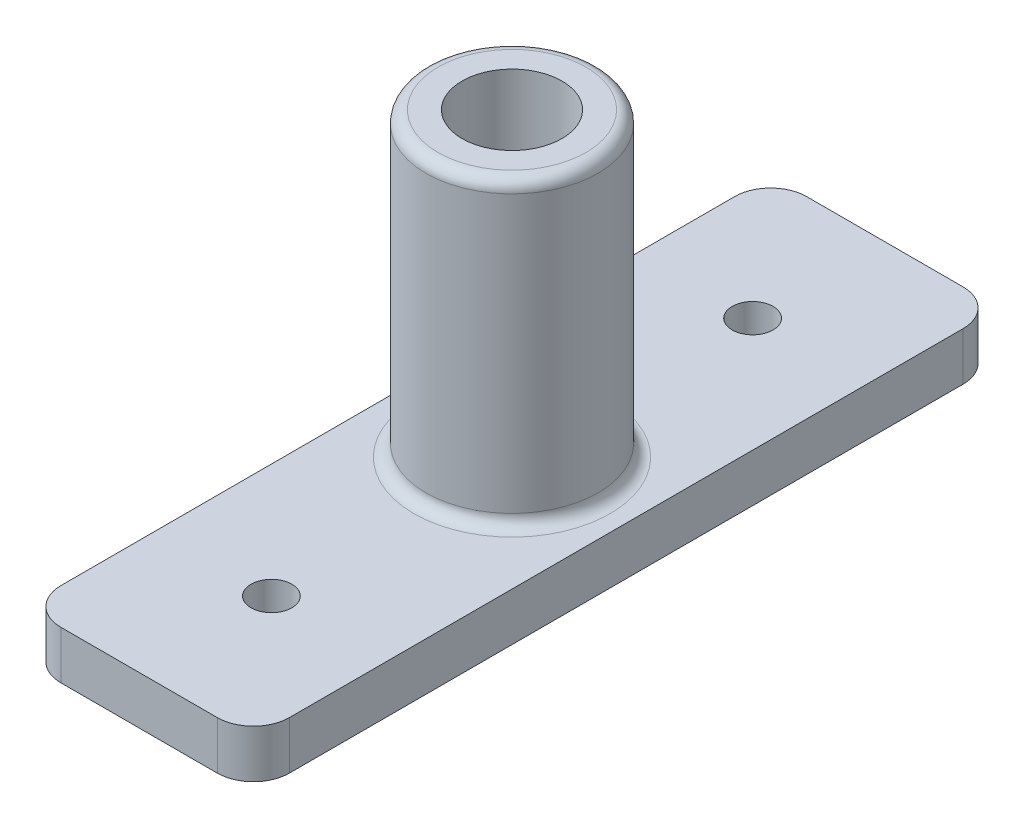
ISO-10303-21;
HEADER;
FILE_DESCRIPTION(('STEP AP214'),'2;1');
FILE_NAME('part.step','',(''),(''),'','','');
FILE_SCHEMA(('AUTOMOTIVE_DESIGN { 1 0 10303 214 1 1 1 1 }'));
ENDSEC;
DATA;
#1=APPLICATION_CONTEXT('core data for automotive mechanical design processes');
#2=APPLICATION_PROTOCOL_DEFINITION('international standard','automotive_design',2000,#1);
#3=PRODUCT_CONTEXT('',#1,'mechanical');
#4=PRODUCT('Part','Part','',(#3));
#5=PRODUCT_RELATED_PRODUCT_CATEGORY('part','',(#4));
#6=PRODUCT_DEFINITION_FORMATION('','',#4);
#7=PRODUCT_DEFINITION_CONTEXT('part definition',#1,'design');
#8=PRODUCT_DEFINITION('design','',#6,#7);
#9=PRODUCT_DEFINITION_SHAPE('','',#8);
#10=(LENGTH_UNIT() NAMED_UNIT(*) SI_UNIT(.MILLI.,.METRE.));
#11=(NAMED_UNIT(*) PLANE_ANGLE_UNIT() SI_UNIT($,.RADIAN.));
#12=(NAMED_UNIT(*) SI_UNIT($,.STERADIAN.) SOLID_ANGLE_UNIT());
#13=UNCERTAINTY_MEASURE_WITH_UNIT(LENGTH_MEASURE(1.E-05),#10,'distance_accuracy_value','');
#14=(GEOMETRIC_REPRESENTATION_CONTEXT(3) GLOBAL_UNCERTAINTY_ASSIGNED_CONTEXT((#13)) GLOBAL_UNIT_ASSIGNED_CONTEXT((#10,
#11,#12)) REPRESENTATION_CONTEXT('',''));
#15=CARTESIAN_POINT('',(0.,0.,0.));
#16=DIRECTION('',(0.,0.,1.));
#17=DIRECTION('',(1.,0.,0.));
#18=AXIS2_PLACEMENT_3D('',#15,#16,#17);
#19=CARTESIAN_POINT('',(0.,4.,0.));
#20=DIRECTION('',(0.,1.,0.));
#21=DIRECTION('',(0.,0.,1.));
#22=AXIS2_PLACEMENT_3D('',#19,#20,#21);
#23=PLANE('',#22);
#24=CARTESIAN_POINT('',(0.,4.,0.));
#25=DIRECTION('',(0.,1.,0.));
#26=DIRECTION('',(0.,0.,1.));
#27=AXIS2_PLACEMENT_3D('',#24,#25,#26);
#28=CIRCLE('',#27,8.15);
#29=CARTESIAN_POINT('',(0.,4.,8.15));
#30=VERTEX_POINT('',#29);
#31=EDGE_CURVE('E11',#30,#30,#28,.F.);
#32=ORIENTED_EDGE('',*,*,#31,.T.);
#33=EDGE_LOOP('',(#32));
#34=FACE_BOUND('',#33,.T.);
#35=CARTESIAN_POINT('',(0.,4.,-20.));
#36=DIRECTION('',(0.,1.,0.));
#37=DIRECTION('',(0.,0.,1.));
#38=AXIS2_PLACEMENT_3D('',#35,#36,#37);
#39=CIRCLE('',#38,1.7);
#40=CARTESIAN_POINT('',(0.,4.,-18.3));
#41=VERTEX_POINT('',#40);
#42=EDGE_CURVE('E130',#41,#41,#39,.T.);
#43=ORIENTED_EDGE('',*,*,#42,.F.);
#44=EDGE_LOOP('',(#43));
#45=FACE_BOUND('',#44,.T.);
#46=DIRECTION('',(-1.,0.,0.));
#47=VECTOR('',#46,1.);
#48=CARTESIAN_POINT('',(9.5,4.,-31.));
#49=LINE('',#48,#47);
#50=CARTESIAN_POINT('',(6.5,4.,-31.));
#51=VERTEX_POINT('',#50);
#52=CARTESIAN_POINT('',(-6.5,4.,-31.));
#53=VERTEX_POINT('',#52);
#54=EDGE_CURVE('E139',#51,#53,#49,.T.);
#55=ORIENTED_EDGE('',*,*,#54,.T.);
#56=CARTESIAN_POINT('',(-6.5,4.,-28.));
#57=DIRECTION('',(0.,1.,0.));
#58=DIRECTION('',(0.,0.,1.));
#59=AXIS2_PLACEMENT_3D('',#56,#57,#58);
#60=CIRCLE('',#59,3.);
#61=CARTESIAN_POINT('',(-9.5,4.,-28.));
#62=VERTEX_POINT('',#61);
#63=EDGE_CURVE('E161',#53,#62,#60,.T.);
#64=ORIENTED_EDGE('',*,*,#63,.T.);
#65=DIRECTION('',(0.,0.,1.));
#66=VECTOR('',#65,1.);
#67=CARTESIAN_POINT('',(-9.5,4.,31.));
#68=LINE('',#67,#66);
#69=CARTESIAN_POINT('',(-9.5,4.,28.));
#70=VERTEX_POINT('',#69);
#71=EDGE_CURVE('E122',#62,#70,#68,.T.);
#72=ORIENTED_EDGE('',*,*,#71,.T.);
#73=CARTESIAN_POINT('',(-6.5,4.,28.));
#74=DIRECTION('',(0.,1.,0.));
#75=DIRECTION('',(0.,0.,1.));
#76=AXIS2_PLACEMENT_3D('',#73,#74,#75);
#77=CIRCLE('',#76,3.);
#78=CARTESIAN_POINT('',(-6.5,4.,31.));
#79=VERTEX_POINT('',#78);
#80=EDGE_CURVE('E159',#70,#79,#77,.T.);
#81=ORIENTED_EDGE('',*,*,#80,.T.);
#82=DIRECTION('',(1.,0.,0.));
#83=VECTOR('',#82,1.);
#84=CARTESIAN_POINT('',(9.5,4.,31.));
#85=LINE('',#84,#83);
#86=CARTESIAN_POINT('',(6.5,4.,31.));
#87=VERTEX_POINT('',#86);
#88=EDGE_CURVE('E209',#79,#87,#85,.T.);
#89=ORIENTED_EDGE('',*,*,#88,.T.);
#90=CARTESIAN_POINT('',(6.5,4.,28.));
#91=DIRECTION('',(0.,1.,0.));
#92=DIRECTION('',(0.,0.,1.));
#93=AXIS2_PLACEMENT_3D('',#90,#91,#92);
#94=CIRCLE('',#93,3.);
#95=CARTESIAN_POINT('',(9.5,4.,28.));
#96=VERTEX_POINT('',#95);
#97=EDGE_CURVE('E57',#87,#96,#94,.T.);
#98=ORIENTED_EDGE('',*,*,#97,.T.);
#99=DIRECTION('',(0.,0.,-1.));
#100=VECTOR('',#99,1.);
#101=CARTESIAN_POINT('',(9.5,4.,31.));
#102=LINE('',#101,#100);
#103=CARTESIAN_POINT('',(9.5,4.,-28.));
#104=VERTEX_POINT('',#103);
#105=EDGE_CURVE('E210',#96,#104,#102,.T.);
#106=ORIENTED_EDGE('',*,*,#105,.T.);
#107=CARTESIAN_POINT('',(6.5,4.,-28.));
#108=DIRECTION('',(0.,1.,0.));
#109=DIRECTION('',(0.,0.,1.));
#110=AXIS2_PLACEMENT_3D('',#107,#108,#109);
#111=CIRCLE('',#110,3.);
#112=EDGE_CURVE('E157',#104,#51,#111,.T.);
#113=ORIENTED_EDGE('',*,*,#112,.T.);
#114=EDGE_LOOP('',(#55,#64,#72,#81,#89,#98,#106,#113));
#115=FACE_BOUND('',#114,.T.);
#116=CARTESIAN_POINT('',(0.,4.,20.));
#117=DIRECTION('',(0.,1.,0.));
#118=DIRECTION('',(0.,0.,1.));
#119=AXIS2_PLACEMENT_3D('',#116,#117,#118);
#120=CIRCLE('',#119,1.7);
#121=CARTESIAN_POINT('',(0.,4.,21.7));
#122=VERTEX_POINT('',#121);
#123=EDGE_CURVE('E201',#122,#122,#120,.T.);
#124=ORIENTED_EDGE('',*,*,#123,.F.);
#125=EDGE_LOOP('',(#124));
#126=FACE_BOUND('',#125,.T.);
#127=ADVANCED_FACE('F35',(#34,#45,#115,#126),#23,.T.);
#128=CARTESIAN_POINT('',(0.,0.,0.));
#129=DIRECTION('',(0.,1.,0.));
#130=DIRECTION('',(0.,0.,1.));
#131=AXIS2_PLACEMENT_3D('',#128,#129,#130);
#132=PLANE('',#131);
#133=DIRECTION('',(0.,0.,1.));
#134=VECTOR('',#133,1.);
#135=CARTESIAN_POINT('',(-9.5,0.,31.));
#136=LINE('',#135,#134);
#137=CARTESIAN_POINT('',(-9.5,0.,-28.));
#138=VERTEX_POINT('',#137);
#139=CARTESIAN_POINT('',(-9.5,0.,28.));
#140=VERTEX_POINT('',#139);
#141=EDGE_CURVE('E119',#138,#140,#136,.T.);
#142=ORIENTED_EDGE('',*,*,#141,.F.);
#143=CARTESIAN_POINT('',(-6.5,0.,-28.));
#144=DIRECTION('',(0.,1.,0.));
#145=DIRECTION('',(0.,0.,1.));
#146=AXIS2_PLACEMENT_3D('',#143,#144,#145);
#147=CIRCLE('',#146,3.);
#148=CARTESIAN_POINT('',(-6.5,0.,-31.));
#149=VERTEX_POINT('',#148);
#150=EDGE_CURVE('E102',#138,#149,#147,.F.);
#151=ORIENTED_EDGE('',*,*,#150,.T.);
#152=DIRECTION('',(-1.,0.,0.));
#153=VECTOR('',#152,1.);
#154=CARTESIAN_POINT('',(9.5,0.,-31.));
#155=LINE('',#154,#153);
#156=CARTESIAN_POINT('',(6.5,0.,-31.));
#157=VERTEX_POINT('',#156);
#158=EDGE_CURVE('E143',#157,#149,#155,.T.);
#159=ORIENTED_EDGE('',*,*,#158,.F.);
#160=CARTESIAN_POINT('',(6.5,0.,-28.));
#161=DIRECTION('',(0.,1.,0.));
#162=DIRECTION('',(0.,0.,1.));
#163=AXIS2_PLACEMENT_3D('',#160,#161,#162);
#164=CIRCLE('',#163,3.);
#165=CARTESIAN_POINT('',(9.5,0.,-28.));
#166=VERTEX_POINT('',#165);
#167=EDGE_CURVE('E150',#157,#166,#164,.F.);
#168=ORIENTED_EDGE('',*,*,#167,.T.);
#169=DIRECTION('',(0.,0.,-1.));
#170=VECTOR('',#169,1.);
#171=CARTESIAN_POINT('',(9.5,0.,31.));
#172=LINE('',#171,#170);
#173=CARTESIAN_POINT('',(9.5,0.,28.));
#174=VERTEX_POINT('',#173);
#175=EDGE_CURVE('E133',#174,#166,#172,.T.);
#176=ORIENTED_EDGE('',*,*,#175,.F.);
#177=CARTESIAN_POINT('',(6.5,0.,28.));
#178=DIRECTION('',(0.,1.,0.));
#179=DIRECTION('',(0.,0.,1.));
#180=AXIS2_PLACEMENT_3D('',#177,#178,#179);
#181=CIRCLE('',#180,3.);
#182=CARTESIAN_POINT('',(6.5,0.,31.));
#183=VERTEX_POINT('',#182);
#184=EDGE_CURVE('E123',#174,#183,#181,.F.);
#185=ORIENTED_EDGE('',*,*,#184,.T.);
#186=DIRECTION('',(1.,0.,0.));
#187=VECTOR('',#186,1.);
#188=CARTESIAN_POINT('',(9.5,0.,31.));
#189=LINE('',#188,#187);
#190=CARTESIAN_POINT('',(-6.5,0.,31.));
#191=VERTEX_POINT('',#190);
#192=EDGE_CURVE('E129',#191,#183,#189,.T.);
#193=ORIENTED_EDGE('',*,*,#192,.F.);
#194=CARTESIAN_POINT('',(-6.5,0.,28.));
#195=DIRECTION('',(0.,1.,0.));
#196=DIRECTION('',(0.,0.,1.));
#197=AXIS2_PLACEMENT_3D('',#194,#195,#196);
#198=CIRCLE('',#197,3.);
#199=EDGE_CURVE('E113',#191,#140,#198,.F.);
#200=ORIENTED_EDGE('',*,*,#199,.T.);
#201=EDGE_LOOP('',(#142,#151,#159,#168,#176,#185,#193,#200));
#202=FACE_BOUND('',#201,.T.);
#203=CARTESIAN_POINT('',(0.,0.,-20.));
#204=DIRECTION('',(0.,1.,0.));
#205=DIRECTION('',(0.,0.,1.));
#206=AXIS2_PLACEMENT_3D('',#203,#204,#205);
#207=CIRCLE('',#206,1.7);
#208=CARTESIAN_POINT('',(0.,0.,-18.3));
#209=VERTEX_POINT('',#208);
#210=EDGE_CURVE('E136',#209,#209,#207,.T.);
#211=ORIENTED_EDGE('',*,*,#210,.T.);
#212=EDGE_LOOP('',(#211));
#213=FACE_BOUND('',#212,.T.);
#214=CARTESIAN_POINT('',(0.,0.,20.));
#215=DIRECTION('',(0.,1.,0.));
#216=DIRECTION('',(0.,0.,1.));
#217=AXIS2_PLACEMENT_3D('',#214,#215,#216);
#218=CIRCLE('',#217,1.7);
#219=CARTESIAN_POINT('',(0.,0.,21.7));
#220=VERTEX_POINT('',#219);
#221=EDGE_CURVE('E198',#220,#220,#218,.T.);
#222=ORIENTED_EDGE('',*,*,#221,.T.);
#223=EDGE_LOOP('',(#222));
#224=FACE_BOUND('',#223,.T.);
#225=ADVANCED_FACE('F126',(#202,#213,#224),#132,.F.);
#226=CARTESIAN_POINT('',(-9.5,4.,31.));
#227=DIRECTION('',(1.,0.,0.));
#228=DIRECTION('',(0.,0.,-1.));
#229=AXIS2_PLACEMENT_3D('',#226,#227,#228);
#230=PLANE('',#229);
#231=ORIENTED_EDGE('',*,*,#71,.F.);
#232=DIRECTION('',(0.,-1.,0.));
#233=VECTOR('',#232,1.);
#234=CARTESIAN_POINT('',(-9.5,4.,-28.));
#235=LINE('',#234,#233);
#236=EDGE_CURVE('E106',#62,#138,#235,.T.);
#237=ORIENTED_EDGE('',*,*,#236,.T.);
#238=ORIENTED_EDGE('',*,*,#141,.T.);
#239=DIRECTION('',(0.,-1.,0.));
#240=VECTOR('',#239,1.);
#241=CARTESIAN_POINT('',(-9.5,4.,28.));
#242=LINE('',#241,#240);
#243=EDGE_CURVE('E124',#140,#70,#242,.F.);
#244=ORIENTED_EDGE('',*,*,#243,.T.);
#245=EDGE_LOOP('',(#231,#237,#238,#244));
#246=FACE_BOUND('',#245,.T.);
#247=ADVANCED_FACE('F118',(#246),#230,.F.);
#248=CARTESIAN_POINT('',(9.5,4.,31.));
#249=DIRECTION('',(0.,0.,-1.));
#250=DIRECTION('',(-1.,0.,0.));
#251=AXIS2_PLACEMENT_3D('',#248,#249,#250);
#252=PLANE('',#251);
#253=ORIENTED_EDGE('',*,*,#88,.F.);
#254=DIRECTION('',(0.,-1.,0.));
#255=VECTOR('',#254,1.);
#256=CARTESIAN_POINT('',(-6.5,4.,31.));
#257=LINE('',#256,#255);
#258=EDGE_CURVE('E165',#79,#191,#257,.T.);
#259=ORIENTED_EDGE('',*,*,#258,.T.);
#260=ORIENTED_EDGE('',*,*,#192,.T.);
#261=DIRECTION('',(0.,-1.,0.));
#262=VECTOR('',#261,1.);
#263=CARTESIAN_POINT('',(6.5,4.,31.));
#264=LINE('',#263,#262);
#265=EDGE_CURVE('E163',#183,#87,#264,.F.);
#266=ORIENTED_EDGE('',*,*,#265,.T.);
#267=EDGE_LOOP('',(#253,#259,#260,#266));
#268=FACE_BOUND('',#267,.T.);
#269=ADVANCED_FACE('F227',(#268),#252,.F.);
#270=CARTESIAN_POINT('',(9.5,4.,31.));
#271=DIRECTION('',(-1.,0.,0.));
#272=DIRECTION('',(0.,0.,1.));
#273=AXIS2_PLACEMENT_3D('',#270,#271,#272);
#274=PLANE('',#273);
#275=ORIENTED_EDGE('',*,*,#175,.T.);
#276=DIRECTION('',(0.,-1.,0.));
#277=VECTOR('',#276,1.);
#278=CARTESIAN_POINT('',(9.5,4.,-28.));
#279=LINE('',#278,#277);
#280=EDGE_CURVE('E50',#166,#104,#279,.F.);
#281=ORIENTED_EDGE('',*,*,#280,.T.);
#282=ORIENTED_EDGE('',*,*,#105,.F.);
#283=DIRECTION('',(0.,-1.,0.));
#284=VECTOR('',#283,1.);
#285=CARTESIAN_POINT('',(9.5,4.,28.));
#286=LINE('',#285,#284);
#287=EDGE_CURVE('E168',#96,#174,#286,.T.);
#288=ORIENTED_EDGE('',*,*,#287,.T.);
#289=EDGE_LOOP('',(#275,#281,#282,#288));
#290=FACE_BOUND('',#289,.T.);
#291=ADVANCED_FACE('F221',(#290),#274,.F.);
#292=CARTESIAN_POINT('',(9.5,4.,-31.));
#293=DIRECTION('',(0.,0.,1.));
#294=DIRECTION('',(1.,0.,0.));
#295=AXIS2_PLACEMENT_3D('',#292,#293,#294);
#296=PLANE('',#295);
#297=ORIENTED_EDGE('',*,*,#158,.T.);
#298=DIRECTION('',(0.,-1.,0.));
#299=VECTOR('',#298,1.);
#300=CARTESIAN_POINT('',(-6.5,4.,-31.));
#301=LINE('',#300,#299);
#302=EDGE_CURVE('E107',#149,#53,#301,.F.);
#303=ORIENTED_EDGE('',*,*,#302,.T.);
#304=ORIENTED_EDGE('',*,*,#54,.F.);
#305=DIRECTION('',(0.,-1.,0.));
#306=VECTOR('',#305,1.);
#307=CARTESIAN_POINT('',(6.5,4.,-31.));
#308=LINE('',#307,#306);
#309=EDGE_CURVE('E112',#51,#157,#308,.T.);
#310=ORIENTED_EDGE('',*,*,#309,.T.);
#311=EDGE_LOOP('',(#297,#303,#304,#310));
#312=FACE_BOUND('',#311,.T.);
#313=ADVANCED_FACE('F217',(#312),#296,.F.);
#314=CARTESIAN_POINT('',(0.,4.,-20.));
#315=DIRECTION('',(0.,-1.,0.));
#316=DIRECTION('',(0.,0.,-1.));
#317=AXIS2_PLACEMENT_3D('',#314,#315,#316);
#318=CYLINDRICAL_SURFACE('',#317,1.7);
#319=ORIENTED_EDGE('',*,*,#42,.T.);
#320=EDGE_LOOP('',(#319));
#321=FACE_BOUND('',#320,.T.);
#322=ORIENTED_EDGE('',*,*,#210,.F.);
#323=EDGE_LOOP('',(#322));
#324=FACE_BOUND('',#323,.T.);
#325=ADVANCED_FACE('F265',(#321,#324),#318,.F.);
#326=CARTESIAN_POINT('',(0.,4.,20.));
#327=DIRECTION('',(0.,-1.,0.));
#328=DIRECTION('',(0.,0.,-1.));
#329=AXIS2_PLACEMENT_3D('',#326,#327,#328);
#330=CYLINDRICAL_SURFACE('',#329,1.7);
#331=ORIENTED_EDGE('',*,*,#123,.T.);
#332=EDGE_LOOP('',(#331));
#333=FACE_BOUND('',#332,.T.);
#334=ORIENTED_EDGE('',*,*,#221,.F.);
#335=EDGE_LOOP('',(#334));
#336=FACE_BOUND('',#335,.T.);
#337=ADVANCED_FACE('F192',(#333,#336),#330,.F.);
#338=CARTESIAN_POINT('',(0.,29.,0.));
#339=DIRECTION('',(0.,1.,0.));
#340=DIRECTION('',(0.,0.,1.));
#341=AXIS2_PLACEMENT_3D('',#338,#339,#340);
#342=PLANE('',#341);
#343=CARTESIAN_POINT('',(0.,29.,0.));
#344=DIRECTION('',(0.,1.,0.));
#345=DIRECTION('',(0.,0.,1.));
#346=AXIS2_PLACEMENT_3D('',#343,#344,#345);
#347=CIRCLE('',#346,6.15);
#348=CARTESIAN_POINT('',(0.,29.,6.15));
#349=VERTEX_POINT('',#348);
#350=EDGE_CURVE('E172',#349,#349,#347,.T.);
#351=ORIENTED_EDGE('',*,*,#350,.T.);
#352=EDGE_LOOP('',(#351));
#353=FACE_BOUND('',#352,.T.);
#354=CARTESIAN_POINT('',(0.,29.,0.));
#355=DIRECTION('',(0.,1.,0.));
#356=DIRECTION('',(0.,0.,1.));
#357=AXIS2_PLACEMENT_3D('',#354,#355,#356);
#358=CIRCLE('',#357,4.15);
#359=CARTESIAN_POINT('',(0.,29.,4.15));
#360=VERTEX_POINT('',#359);
#361=EDGE_CURVE('E196',#360,#360,#358,.T.);
#362=ORIENTED_EDGE('',*,*,#361,.F.);
#363=EDGE_LOOP('',(#362));
#364=FACE_BOUND('',#363,.T.);
#365=ADVANCED_FACE('F189',(#353,#364),#342,.T.);
#366=CARTESIAN_POINT('',(0.,29.,0.));
#367=DIRECTION('',(0.,-1.,0.));
#368=DIRECTION('',(0.,0.,-1.));
#369=AXIS2_PLACEMENT_3D('',#366,#367,#368);
#370=CYLINDRICAL_SURFACE('',#369,7.15);
#371=CARTESIAN_POINT('',(0.,28.,0.));
#372=DIRECTION('',(0.,1.,0.));
#373=DIRECTION('',(0.,0.,1.));
#374=AXIS2_PLACEMENT_3D('',#371,#372,#373);
#375=CIRCLE('',#374,7.15);
#376=CARTESIAN_POINT('',(0.,28.,7.15));
#377=VERTEX_POINT('',#376);
#378=EDGE_CURVE('E43',#377,#377,#375,.F.);
#379=ORIENTED_EDGE('',*,*,#378,.T.);
#380=EDGE_LOOP('',(#379));
#381=FACE_BOUND('',#380,.T.);
#382=CARTESIAN_POINT('',(0.,5.,0.));
#383=DIRECTION('',(0.,1.,0.));
#384=DIRECTION('',(0.,0.,1.));
#385=AXIS2_PLACEMENT_3D('',#382,#383,#384);
#386=CIRCLE('',#385,7.15);
#387=CARTESIAN_POINT('',(0.,5.,7.15));
#388=VERTEX_POINT('',#387);
#389=EDGE_CURVE('E175',#388,#388,#386,.T.);
#390=ORIENTED_EDGE('',*,*,#389,.T.);
#391=EDGE_LOOP('',(#390));
#392=FACE_BOUND('',#391,.T.);
#393=ADVANCED_FACE('F180',(#381,#392),#370,.T.);
#394=CARTESIAN_POINT('',(0.,29.,0.));
#395=DIRECTION('',(0.,-1.,0.));
#396=DIRECTION('',(0.,0.,-1.));
#397=AXIS2_PLACEMENT_3D('',#394,#395,#396);
#398=CYLINDRICAL_SURFACE('',#397,4.15);
#399=ORIENTED_EDGE('',*,*,#361,.T.);
#400=EDGE_LOOP('',(#399));
#401=FACE_BOUND('',#400,.T.);
#402=CARTESIAN_POINT('',(0.,4.,0.));
#403=DIRECTION('',(0.,1.,0.));
#404=DIRECTION('',(0.,0.,1.));
#405=AXIS2_PLACEMENT_3D('',#402,#403,#404);
#406=CIRCLE('',#405,4.15);
#407=CARTESIAN_POINT('',(0.,4.,4.15));
#408=VERTEX_POINT('',#407);
#409=EDGE_CURVE('E145',#408,#408,#406,.F.);
#410=ORIENTED_EDGE('',*,*,#409,.T.);
#411=EDGE_LOOP('',(#410));
#412=FACE_BOUND('',#411,.T.);
#413=ADVANCED_FACE('F251',(#401,#412),#398,.F.);
#414=ORIENTED_EDGE('',*,*,#409,.F.);
#415=EDGE_LOOP('',(#414));
#416=FACE_BOUND('',#415,.T.);
#417=ADVANCED_FACE('F239',(#416),#23,.T.);
#418=CARTESIAN_POINT('',(-6.5,4.,-28.));
#419=DIRECTION('',(0.,-1.,0.));
#420=DIRECTION('',(0.,0.,-1.));
#421=AXIS2_PLACEMENT_3D('',#418,#419,#420);
#422=CYLINDRICAL_SURFACE('',#421,3.);
#423=ORIENTED_EDGE('',*,*,#63,.F.);
#424=ORIENTED_EDGE('',*,*,#302,.F.);
#425=ORIENTED_EDGE('',*,*,#150,.F.);
#426=ORIENTED_EDGE('',*,*,#236,.F.);
#427=EDGE_LOOP('',(#423,#424,#425,#426));
#428=FACE_BOUND('',#427,.T.);
#429=ADVANCED_FACE('F105',(#428),#422,.T.);
#430=CARTESIAN_POINT('',(-6.5,4.,28.));
#431=DIRECTION('',(0.,-1.,0.));
#432=DIRECTION('',(0.,0.,-1.));
#433=AXIS2_PLACEMENT_3D('',#430,#431,#432);
#434=CYLINDRICAL_SURFACE('',#433,3.);
#435=ORIENTED_EDGE('',*,*,#80,.F.);
#436=ORIENTED_EDGE('',*,*,#243,.F.);
#437=ORIENTED_EDGE('',*,*,#199,.F.);
#438=ORIENTED_EDGE('',*,*,#258,.F.);
#439=EDGE_LOOP('',(#435,#436,#437,#438));
#440=FACE_BOUND('',#439,.T.);
#441=ADVANCED_FACE('F231',(#440),#434,.T.);
#442=CARTESIAN_POINT('',(6.5,4.,-28.));
#443=DIRECTION('',(0.,-1.,0.));
#444=DIRECTION('',(0.,0.,-1.));
#445=AXIS2_PLACEMENT_3D('',#442,#443,#444);
#446=CYLINDRICAL_SURFACE('',#445,3.);
#447=ORIENTED_EDGE('',*,*,#112,.F.);
#448=ORIENTED_EDGE('',*,*,#280,.F.);
#449=ORIENTED_EDGE('',*,*,#167,.F.);
#450=ORIENTED_EDGE('',*,*,#309,.F.);
#451=EDGE_LOOP('',(#447,#448,#449,#450));
#452=FACE_BOUND('',#451,.T.);
#453=ADVANCED_FACE('F219',(#452),#446,.T.);
#454=CARTESIAN_POINT('',(6.5,4.,28.));
#455=DIRECTION('',(0.,-1.,0.));
#456=DIRECTION('',(0.,0.,-1.));
#457=AXIS2_PLACEMENT_3D('',#454,#455,#456);
#458=CYLINDRICAL_SURFACE('',#457,3.);
#459=ORIENTED_EDGE('',*,*,#97,.F.);
#460=ORIENTED_EDGE('',*,*,#265,.F.);
#461=ORIENTED_EDGE('',*,*,#184,.F.);
#462=ORIENTED_EDGE('',*,*,#287,.F.);
#463=EDGE_LOOP('',(#459,#460,#461,#462));
#464=FACE_BOUND('',#463,.T.);
#465=ADVANCED_FACE('F186',(#464),#458,.T.);
#466=CARTESIAN_POINT('',(0.,28.,0.));
#467=DIRECTION('',(0.,1.,0.));
#468=DIRECTION('',(0.,0.,1.));
#469=AXIS2_PLACEMENT_3D('',#466,#467,#468);
#470=TOROIDAL_SURFACE('',#469,6.15,1.);
#471=ORIENTED_EDGE('',*,*,#378,.F.);
#472=EDGE_LOOP('',(#471));
#473=FACE_BOUND('',#472,.T.);
#474=ORIENTED_EDGE('',*,*,#350,.F.);
#475=EDGE_LOOP('',(#474));
#476=FACE_BOUND('',#475,.T.);
#477=ADVANCED_FACE('F183',(#473,#476),#470,.T.);
#478=CARTESIAN_POINT('',(0.,5.,0.));
#479=DIRECTION('',(0.,1.,0.));
#480=DIRECTION('',(0.,0.,1.));
#481=AXIS2_PLACEMENT_3D('',#478,#479,#480);
#482=TOROIDAL_SURFACE('',#481,8.15,1.);
#483=ORIENTED_EDGE('',*,*,#31,.F.);
#484=EDGE_LOOP('',(#483));
#485=FACE_BOUND('',#484,.T.);
#486=ORIENTED_EDGE('',*,*,#389,.F.);
#487=EDGE_LOOP('',(#486));
#488=FACE_BOUND('',#487,.T.);
#489=ADVANCED_FACE('F37',(#485,#488),#482,.F.);
#490=CLOSED_SHELL('',(#127,#225,#247,#269,#291,#313,#325,#337,#365,#393,#413,#417,#429,#441,
#453,#465,#477,#489));
#491=MANIFOLD_SOLID_BREP('B2',#490);
#492=ADVANCED_BREP_SHAPE_REPRESENTATION('',(#18,#491),#14);
#493=SHAPE_DEFINITION_REPRESENTATION(#9,#492);
ENDSEC;
END-ISO-10303-21;
